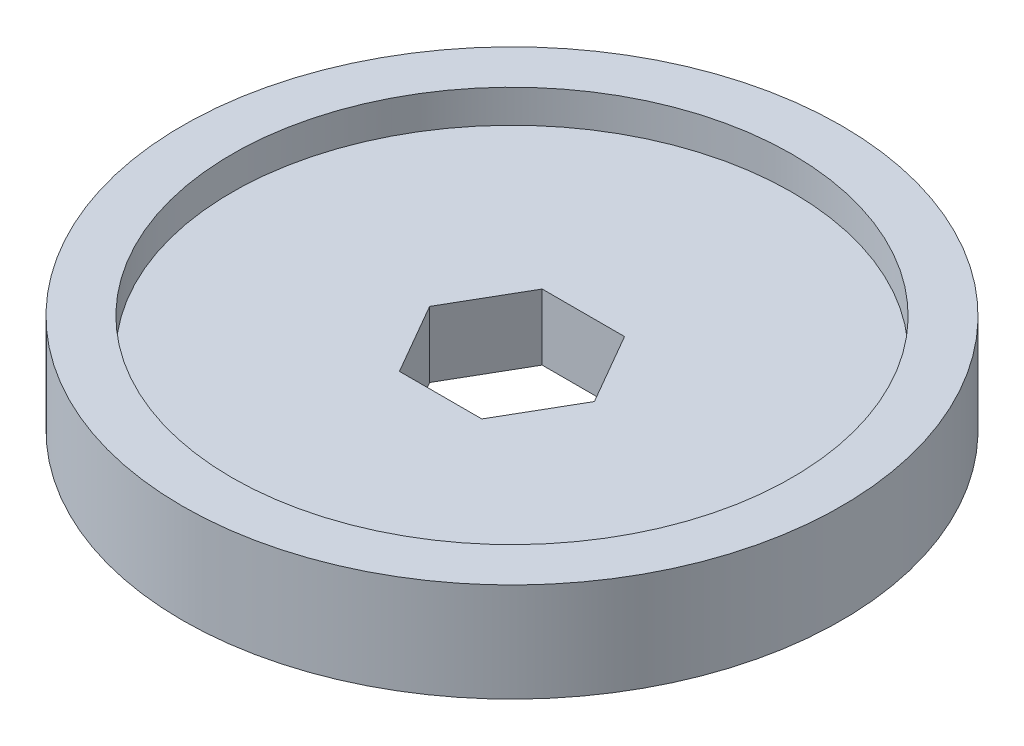
ISO-10303-21;
HEADER;
FILE_DESCRIPTION(('STEP AP214'),'2;1');
FILE_NAME('part.step','',(''),(''),'','','');
FILE_SCHEMA(('AUTOMOTIVE_DESIGN { 1 0 10303 214 1 1 1 1 }'));
ENDSEC;
DATA;
#1=APPLICATION_CONTEXT('core data for automotive mechanical design processes');
#2=APPLICATION_PROTOCOL_DEFINITION('international standard','automotive_design',2000,#1);
#3=PRODUCT_CONTEXT('',#1,'mechanical');
#4=PRODUCT('Part','Part','',(#3));
#5=PRODUCT_RELATED_PRODUCT_CATEGORY('part','',(#4));
#6=PRODUCT_DEFINITION_FORMATION('','',#4);
#7=PRODUCT_DEFINITION_CONTEXT('part definition',#1,'design');
#8=PRODUCT_DEFINITION('design','',#6,#7);
#9=PRODUCT_DEFINITION_SHAPE('','',#8);
#10=(LENGTH_UNIT() NAMED_UNIT(*) SI_UNIT(.MILLI.,.METRE.));
#11=(NAMED_UNIT(*) PLANE_ANGLE_UNIT() SI_UNIT($,.RADIAN.));
#12=(NAMED_UNIT(*) SI_UNIT($,.STERADIAN.) SOLID_ANGLE_UNIT());
#13=UNCERTAINTY_MEASURE_WITH_UNIT(LENGTH_MEASURE(1.E-05),#10,'distance_accuracy_value','');
#14=(GEOMETRIC_REPRESENTATION_CONTEXT(3) GLOBAL_UNCERTAINTY_ASSIGNED_CONTEXT((#13)) GLOBAL_UNIT_ASSIGNED_CONTEXT((#10,
#11,#12)) REPRESENTATION_CONTEXT('',''));
#15=CARTESIAN_POINT('',(0.,0.,0.));
#16=DIRECTION('',(0.,0.,1.));
#17=DIRECTION('',(1.,0.,0.));
#18=AXIS2_PLACEMENT_3D('',#15,#16,#17);
#19=CARTESIAN_POINT('',(0.,5.08,0.));
#20=DIRECTION('',(0.,1.,0.));
#21=DIRECTION('',(0.,0.,1.));
#22=AXIS2_PLACEMENT_3D('',#19,#20,#21);
#23=PLANE('',#22);
#24=DIRECTION('',(-0.500000000000001,0.,-0.866025403784438));
#25=VECTOR('',#24,1.);
#26=CARTESIAN_POINT('',(6.35,5.08,0.));
#27=LINE('',#26,#25);
#28=CARTESIAN_POINT('',(6.35,5.08,0.));
#29=VERTEX_POINT('',#28);
#30=CARTESIAN_POINT('',(3.17499999999999,5.08,-5.49926131403119));
#31=VERTEX_POINT('',#30);
#32=EDGE_CURVE('E104',#29,#31,#27,.T.);
#33=ORIENTED_EDGE('',*,*,#32,.F.);
#34=DIRECTION('',(0.499999999999995,0.,-0.866025403784441));
#35=VECTOR('',#34,1.);
#36=CARTESIAN_POINT('',(3.17500000000006,5.08,5.49926131403115));
#37=LINE('',#36,#35);
#38=CARTESIAN_POINT('',(3.17500000000006,5.08,5.49926131403115));
#39=VERTEX_POINT('',#38);
#40=EDGE_CURVE('E96',#39,#29,#37,.T.);
#41=ORIENTED_EDGE('',*,*,#40,.F.);
#42=DIRECTION('',(1.,0.,0.));
#43=VECTOR('',#42,1.);
#44=CARTESIAN_POINT('',(-3.17499999999995,5.08,5.49926131403121));
#45=LINE('',#44,#43);
#46=CARTESIAN_POINT('',(-3.17499999999995,5.08,5.49926131403121));
#47=VERTEX_POINT('',#46);
#48=EDGE_CURVE('E126',#47,#39,#45,.T.);
#49=ORIENTED_EDGE('',*,*,#48,.F.);
#50=DIRECTION('',(0.500000000000007,0.,0.866025403784434));
#51=VECTOR('',#50,1.);
#52=CARTESIAN_POINT('',(-6.35,5.08,0.));
#53=LINE('',#52,#51);
#54=CARTESIAN_POINT('',(-6.35,5.08,0.));
#55=VERTEX_POINT('',#54);
#56=EDGE_CURVE('E124',#55,#47,#53,.T.);
#57=ORIENTED_EDGE('',*,*,#56,.F.);
#58=DIRECTION('',(-0.499999999999995,0.,0.866025403784442));
#59=VECTOR('',#58,1.);
#60=CARTESIAN_POINT('',(-3.17500000000003,5.08,-5.49926131403117));
#61=LINE('',#60,#59);
#62=CARTESIAN_POINT('',(-3.17500000000003,5.08,-5.49926131403117));
#63=VERTEX_POINT('',#62);
#64=EDGE_CURVE('E119',#63,#55,#61,.T.);
#65=ORIENTED_EDGE('',*,*,#64,.F.);
#66=DIRECTION('',(-1.,0.,0.));
#67=VECTOR('',#66,1.);
#68=CARTESIAN_POINT('',(3.17499999999999,5.08,-5.49926131403119));
#69=LINE('',#68,#67);
#70=EDGE_CURVE('E117',#31,#63,#69,.T.);
#71=ORIENTED_EDGE('',*,*,#70,.F.);
#72=EDGE_LOOP('',(#33,#41,#49,#57,#65,#71));
#73=FACE_BOUND('',#72,.T.);
#74=CARTESIAN_POINT('',(0.,5.08,0.));
#75=DIRECTION('',(0.,1.,0.));
#76=DIRECTION('',(0.,0.,1.));
#77=AXIS2_PLACEMENT_3D('',#74,#75,#76);
#78=CIRCLE('',#77,21.59);
#79=CARTESIAN_POINT('',(0.,5.08,21.59));
#80=VERTEX_POINT('',#79);
#81=EDGE_CURVE('E11',#80,#80,#78,.F.);
#82=ORIENTED_EDGE('',*,*,#81,.F.);
#83=EDGE_LOOP('',(#82));
#84=FACE_BOUND('',#83,.T.);
#85=ADVANCED_FACE('F43',(#73,#84),#23,.T.);
#86=CARTESIAN_POINT('',(0.,0.,0.));
#87=DIRECTION('',(0.,1.,0.));
#88=DIRECTION('',(0.,0.,1.));
#89=AXIS2_PLACEMENT_3D('',#86,#87,#88);
#90=PLANE('',#89);
#91=CARTESIAN_POINT('',(0.,0.,0.));
#92=DIRECTION('',(0.,1.,0.));
#93=DIRECTION('',(0.,0.,1.));
#94=AXIS2_PLACEMENT_3D('',#91,#92,#93);
#95=CIRCLE('',#94,25.4);
#96=CARTESIAN_POINT('',(0.,0.,25.4));
#97=VERTEX_POINT('',#96);
#98=EDGE_CURVE('E51',#97,#97,#95,.T.);
#99=ORIENTED_EDGE('',*,*,#98,.F.);
#100=EDGE_LOOP('',(#99));
#101=FACE_BOUND('',#100,.T.);
#102=DIRECTION('',(0.499999999999995,0.,-0.866025403784441));
#103=VECTOR('',#102,1.);
#104=CARTESIAN_POINT('',(3.17500000000006,0.,5.49926131403115));
#105=LINE('',#104,#103);
#106=CARTESIAN_POINT('',(3.17500000000006,0.,5.49926131403115));
#107=VERTEX_POINT('',#106);
#108=CARTESIAN_POINT('',(6.35,0.,0.));
#109=VERTEX_POINT('',#108);
#110=EDGE_CURVE('E66',#107,#109,#105,.T.);
#111=ORIENTED_EDGE('',*,*,#110,.T.);
#112=DIRECTION('',(-0.500000000000001,0.,-0.866025403784438));
#113=VECTOR('',#112,1.);
#114=CARTESIAN_POINT('',(6.35,0.,0.));
#115=LINE('',#114,#113);
#116=CARTESIAN_POINT('',(3.17499999999999,0.,-5.49926131403119));
#117=VERTEX_POINT('',#116);
#118=EDGE_CURVE('E111',#109,#117,#115,.T.);
#119=ORIENTED_EDGE('',*,*,#118,.T.);
#120=DIRECTION('',(-1.,0.,0.));
#121=VECTOR('',#120,1.);
#122=CARTESIAN_POINT('',(3.17499999999999,0.,-5.49926131403119));
#123=LINE('',#122,#121);
#124=CARTESIAN_POINT('',(-3.17500000000003,0.,-5.49926131403117));
#125=VERTEX_POINT('',#124);
#126=EDGE_CURVE('E131',#117,#125,#123,.T.);
#127=ORIENTED_EDGE('',*,*,#126,.T.);
#128=DIRECTION('',(-0.499999999999995,0.,0.866025403784442));
#129=VECTOR('',#128,1.);
#130=CARTESIAN_POINT('',(-3.17500000000003,0.,-5.49926131403117));
#131=LINE('',#130,#129);
#132=CARTESIAN_POINT('',(-6.35,0.,0.));
#133=VERTEX_POINT('',#132);
#134=EDGE_CURVE('E134',#125,#133,#131,.T.);
#135=ORIENTED_EDGE('',*,*,#134,.T.);
#136=DIRECTION('',(0.500000000000007,0.,0.866025403784434));
#137=VECTOR('',#136,1.);
#138=CARTESIAN_POINT('',(-6.35,0.,0.));
#139=LINE('',#138,#137);
#140=CARTESIAN_POINT('',(-3.17499999999995,0.,5.49926131403121));
#141=VERTEX_POINT('',#140);
#142=EDGE_CURVE('E137',#133,#141,#139,.T.);
#143=ORIENTED_EDGE('',*,*,#142,.T.);
#144=DIRECTION('',(1.,0.,0.));
#145=VECTOR('',#144,1.);
#146=CARTESIAN_POINT('',(-3.17499999999995,0.,5.49926131403121));
#147=LINE('',#146,#145);
#148=EDGE_CURVE('E105',#141,#107,#147,.T.);
#149=ORIENTED_EDGE('',*,*,#148,.T.);
#150=EDGE_LOOP('',(#111,#119,#127,#135,#143,#149));
#151=FACE_BOUND('',#150,.T.);
#152=ADVANCED_FACE('F153',(#101,#151),#90,.F.);
#153=CARTESIAN_POINT('',(0.,5.08,0.));
#154=DIRECTION('',(0.,-1.,0.));
#155=DIRECTION('',(0.,0.,-1.));
#156=AXIS2_PLACEMENT_3D('',#153,#154,#155);
#157=CYLINDRICAL_SURFACE('',#156,25.4);
#158=ORIENTED_EDGE('',*,*,#98,.T.);
#159=EDGE_LOOP('',(#158));
#160=FACE_BOUND('',#159,.T.);
#161=CARTESIAN_POINT('',(0.,7.62,0.));
#162=DIRECTION('',(0.,1.,0.));
#163=DIRECTION('',(0.,0.,1.));
#164=AXIS2_PLACEMENT_3D('',#161,#162,#163);
#165=CIRCLE('',#164,25.4);
#166=CARTESIAN_POINT('',(0.,7.62,25.4));
#167=VERTEX_POINT('',#166);
#168=EDGE_CURVE('E129',#167,#167,#165,.T.);
#169=ORIENTED_EDGE('',*,*,#168,.F.);
#170=EDGE_LOOP('',(#169));
#171=FACE_BOUND('',#170,.T.);
#172=ADVANCED_FACE('F45',(#160,#171),#157,.T.);
#173=CARTESIAN_POINT('',(3.17500000000006,5.08,5.49926131403115));
#174=DIRECTION('',(-0.866025403784442,0.,-0.499999999999995));
#175=DIRECTION('',(-0.499999999999995,0.,0.866025403784442));
#176=AXIS2_PLACEMENT_3D('',#173,#174,#175);
#177=PLANE('',#176);
#178=ORIENTED_EDGE('',*,*,#110,.F.);
#179=DIRECTION('',(0.,-1.,0.));
#180=VECTOR('',#179,1.);
#181=CARTESIAN_POINT('',(3.17500000000006,5.08,5.49926131403115));
#182=LINE('',#181,#180);
#183=EDGE_CURVE('E100',#39,#107,#182,.T.);
#184=ORIENTED_EDGE('',*,*,#183,.F.);
#185=ORIENTED_EDGE('',*,*,#40,.T.);
#186=DIRECTION('',(0.,-1.,0.));
#187=VECTOR('',#186,1.);
#188=CARTESIAN_POINT('',(6.35,5.08,0.));
#189=LINE('',#188,#187);
#190=EDGE_CURVE('E99',#29,#109,#189,.T.);
#191=ORIENTED_EDGE('',*,*,#190,.T.);
#192=EDGE_LOOP('',(#178,#184,#185,#191));
#193=FACE_BOUND('',#192,.T.);
#194=ADVANCED_FACE('F98',(#193),#177,.T.);
#195=CARTESIAN_POINT('',(6.35,5.08,0.));
#196=DIRECTION('',(-0.866025403784438,0.,0.500000000000001));
#197=DIRECTION('',(0.500000000000001,0.,0.866025403784438));
#198=AXIS2_PLACEMENT_3D('',#195,#196,#197);
#199=PLANE('',#198);
#200=ORIENTED_EDGE('',*,*,#118,.F.);
#201=ORIENTED_EDGE('',*,*,#190,.F.);
#202=ORIENTED_EDGE('',*,*,#32,.T.);
#203=DIRECTION('',(0.,-1.,0.));
#204=VECTOR('',#203,1.);
#205=CARTESIAN_POINT('',(3.17499999999999,5.08,-5.49926131403119));
#206=LINE('',#205,#204);
#207=EDGE_CURVE('E112',#31,#117,#206,.T.);
#208=ORIENTED_EDGE('',*,*,#207,.T.);
#209=EDGE_LOOP('',(#200,#201,#202,#208));
#210=FACE_BOUND('',#209,.T.);
#211=ADVANCED_FACE('F108',(#210),#199,.T.);
#212=CARTESIAN_POINT('',(3.17499999999999,5.08,-5.49926131403119));
#213=DIRECTION('',(0.,0.,1.));
#214=DIRECTION('',(1.,0.,0.));
#215=AXIS2_PLACEMENT_3D('',#212,#213,#214);
#216=PLANE('',#215);
#217=ORIENTED_EDGE('',*,*,#126,.F.);
#218=ORIENTED_EDGE('',*,*,#207,.F.);
#219=ORIENTED_EDGE('',*,*,#70,.T.);
#220=DIRECTION('',(0.,-1.,0.));
#221=VECTOR('',#220,1.);
#222=CARTESIAN_POINT('',(-3.17500000000003,5.08,-5.49926131403117));
#223=LINE('',#222,#221);
#224=EDGE_CURVE('E146',#63,#125,#223,.T.);
#225=ORIENTED_EDGE('',*,*,#224,.T.);
#226=EDGE_LOOP('',(#217,#218,#219,#225));
#227=FACE_BOUND('',#226,.T.);
#228=ADVANCED_FACE('F168',(#227),#216,.T.);
#229=CARTESIAN_POINT('',(-3.17500000000003,5.08,-5.49926131403117));
#230=DIRECTION('',(0.866025403784441,0.,0.499999999999995));
#231=DIRECTION('',(0.499999999999995,0.,-0.866025403784442));
#232=AXIS2_PLACEMENT_3D('',#229,#230,#231);
#233=PLANE('',#232);
#234=ORIENTED_EDGE('',*,*,#134,.F.);
#235=ORIENTED_EDGE('',*,*,#224,.F.);
#236=ORIENTED_EDGE('',*,*,#64,.T.);
#237=DIRECTION('',(0.,-1.,0.));
#238=VECTOR('',#237,1.);
#239=CARTESIAN_POINT('',(-6.35,5.08,0.));
#240=LINE('',#239,#238);
#241=EDGE_CURVE('E144',#55,#133,#240,.T.);
#242=ORIENTED_EDGE('',*,*,#241,.T.);
#243=EDGE_LOOP('',(#234,#235,#236,#242));
#244=FACE_BOUND('',#243,.T.);
#245=ADVANCED_FACE('F164',(#244),#233,.T.);
#246=CARTESIAN_POINT('',(-6.35,5.08,0.));
#247=DIRECTION('',(0.866025403784434,0.,-0.500000000000007));
#248=DIRECTION('',(-0.500000000000007,0.,-0.866025403784435));
#249=AXIS2_PLACEMENT_3D('',#246,#247,#248);
#250=PLANE('',#249);
#251=ORIENTED_EDGE('',*,*,#142,.F.);
#252=ORIENTED_EDGE('',*,*,#241,.F.);
#253=ORIENTED_EDGE('',*,*,#56,.T.);
#254=DIRECTION('',(0.,-1.,0.));
#255=VECTOR('',#254,1.);
#256=CARTESIAN_POINT('',(-3.17499999999995,5.08,5.49926131403121));
#257=LINE('',#256,#255);
#258=EDGE_CURVE('E58',#47,#141,#257,.T.);
#259=ORIENTED_EDGE('',*,*,#258,.T.);
#260=EDGE_LOOP('',(#251,#252,#253,#259));
#261=FACE_BOUND('',#260,.T.);
#262=ADVANCED_FACE('F161',(#261),#250,.T.);
#263=CARTESIAN_POINT('',(-3.17499999999995,5.08,5.49926131403121));
#264=DIRECTION('',(0.,0.,-1.));
#265=DIRECTION('',(-1.,0.,0.));
#266=AXIS2_PLACEMENT_3D('',#263,#264,#265);
#267=PLANE('',#266);
#268=ORIENTED_EDGE('',*,*,#148,.F.);
#269=ORIENTED_EDGE('',*,*,#258,.F.);
#270=ORIENTED_EDGE('',*,*,#48,.T.);
#271=ORIENTED_EDGE('',*,*,#183,.T.);
#272=EDGE_LOOP('',(#268,#269,#270,#271));
#273=FACE_BOUND('',#272,.T.);
#274=ADVANCED_FACE('F157',(#273),#267,.T.);
#275=CARTESIAN_POINT('',(0.,7.62,0.));
#276=DIRECTION('',(0.,1.,0.));
#277=DIRECTION('',(0.,0.,1.));
#278=AXIS2_PLACEMENT_3D('',#275,#276,#277);
#279=PLANE('',#278);
#280=ORIENTED_EDGE('',*,*,#168,.T.);
#281=EDGE_LOOP('',(#280));
#282=FACE_BOUND('',#281,.T.);
#283=CARTESIAN_POINT('',(0.,7.62,0.));
#284=DIRECTION('',(0.,1.,0.));
#285=DIRECTION('',(0.,0.,1.));
#286=AXIS2_PLACEMENT_3D('',#283,#284,#285);
#287=CIRCLE('',#286,21.59);
#288=CARTESIAN_POINT('',(0.,7.62,21.59));
#289=VERTEX_POINT('',#288);
#290=EDGE_CURVE('E264',#289,#289,#287,.T.);
#291=ORIENTED_EDGE('',*,*,#290,.F.);
#292=EDGE_LOOP('',(#291));
#293=FACE_BOUND('',#292,.T.);
#294=ADVANCED_FACE('F195',(#282,#293),#279,.T.);
#295=CARTESIAN_POINT('',(0.,7.62,0.));
#296=DIRECTION('',(0.,-1.,0.));
#297=DIRECTION('',(0.,0.,-1.));
#298=AXIS2_PLACEMENT_3D('',#295,#296,#297);
#299=CYLINDRICAL_SURFACE('',#298,21.59);
#300=ORIENTED_EDGE('',*,*,#290,.T.);
#301=EDGE_LOOP('',(#300));
#302=FACE_BOUND('',#301,.T.);
#303=ORIENTED_EDGE('',*,*,#81,.T.);
#304=EDGE_LOOP('',(#303));
#305=FACE_BOUND('',#304,.T.);
#306=ADVANCED_FACE('F198',(#302,#305),#299,.F.);
#307=CLOSED_SHELL('',(#85,#152,#172,#194,#211,#228,#245,#262,#274,#294,#306));
#308=MANIFOLD_SOLID_BREP('B2',#307);
#309=ADVANCED_BREP_SHAPE_REPRESENTATION('',(#18,#308),#14);
#310=SHAPE_DEFINITION_REPRESENTATION(#9,#309);
ENDSEC;
END-ISO-10303-21;
